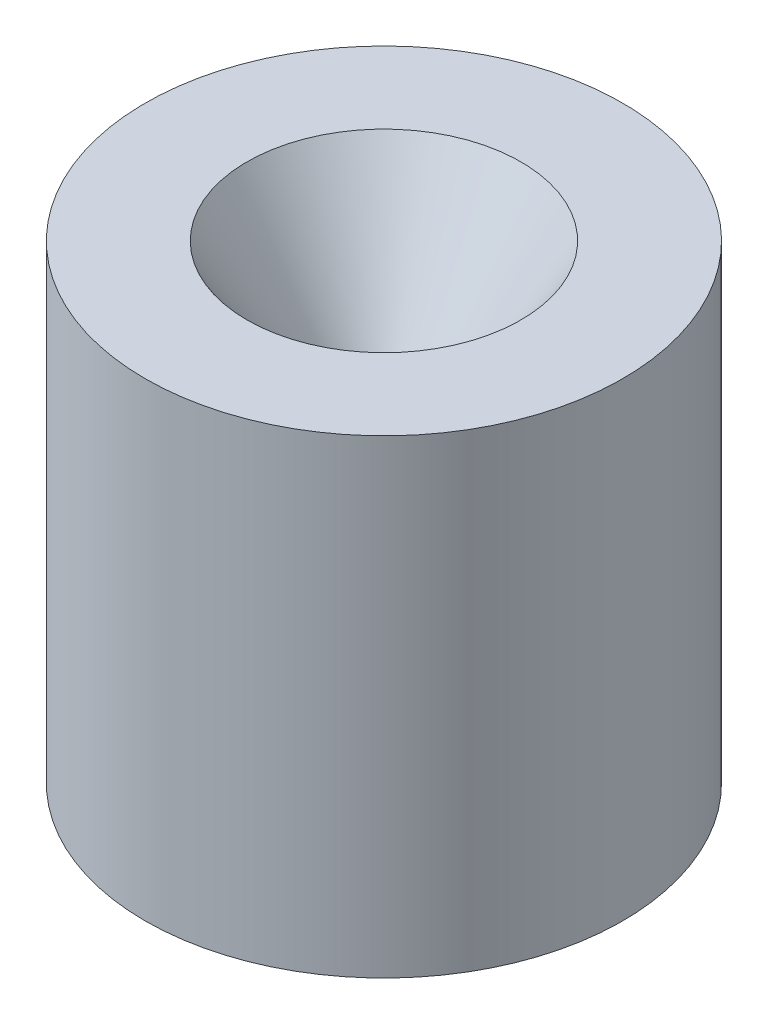
ISO-10303-21;
HEADER;
FILE_DESCRIPTION(('STEP AP214'),'2;1');
FILE_NAME('part.step','',(''),(''),'','','');
FILE_SCHEMA(('AUTOMOTIVE_DESIGN { 1 0 10303 214 1 1 1 1 }'));
ENDSEC;
DATA;
#1=APPLICATION_CONTEXT('core data for automotive mechanical design processes');
#2=APPLICATION_PROTOCOL_DEFINITION('international standard','automotive_design',2000,#1);
#3=PRODUCT_CONTEXT('',#1,'mechanical');
#4=PRODUCT('Part','Part','',(#3));
#5=PRODUCT_RELATED_PRODUCT_CATEGORY('part','',(#4));
#6=PRODUCT_DEFINITION_FORMATION('','',#4);
#7=PRODUCT_DEFINITION_CONTEXT('part definition',#1,'design');
#8=PRODUCT_DEFINITION('design','',#6,#7);
#9=PRODUCT_DEFINITION_SHAPE('','',#8);
#10=(LENGTH_UNIT() NAMED_UNIT(*) SI_UNIT(.MILLI.,.METRE.));
#11=(NAMED_UNIT(*) PLANE_ANGLE_UNIT() SI_UNIT($,.RADIAN.));
#12=(NAMED_UNIT(*) SI_UNIT($,.STERADIAN.) SOLID_ANGLE_UNIT());
#13=UNCERTAINTY_MEASURE_WITH_UNIT(LENGTH_MEASURE(1.E-05),#10,'distance_accuracy_value','');
#14=(GEOMETRIC_REPRESENTATION_CONTEXT(3) GLOBAL_UNCERTAINTY_ASSIGNED_CONTEXT((#13)) GLOBAL_UNIT_ASSIGNED_CONTEXT((#10,
#11,#12)) REPRESENTATION_CONTEXT('',''));
#15=CARTESIAN_POINT('',(0.,0.,0.));
#16=DIRECTION('',(0.,0.,1.));
#17=DIRECTION('',(1.,0.,0.));
#18=AXIS2_PLACEMENT_3D('',#15,#16,#17);
#19=CARTESIAN_POINT('',(0.,120.,0.));
#20=DIRECTION('',(0.,-1.,0.));
#21=DIRECTION('',(0.,0.,-1.));
#22=AXIS2_PLACEMENT_3D('',#19,#20,#21);
#23=CYLINDRICAL_SURFACE('',#22,61.);
#24=CARTESIAN_POINT('',(0.,120.,0.));
#25=DIRECTION('',(0.,1.,0.));
#26=DIRECTION('',(0.,0.,1.));
#27=AXIS2_PLACEMENT_3D('',#24,#25,#26);
#28=CIRCLE('',#27,61.);
#29=CARTESIAN_POINT('',(0.,120.,61.));
#30=VERTEX_POINT('',#29);
#31=EDGE_CURVE('E10',#30,#30,#28,.T.);
#32=ORIENTED_EDGE('',*,*,#31,.F.);
#33=EDGE_LOOP('',(#32));
#34=FACE_BOUND('',#33,.T.);
#35=CARTESIAN_POINT('',(0.,0.,0.));
#36=DIRECTION('',(0.,1.,0.));
#37=DIRECTION('',(0.,0.,1.));
#38=AXIS2_PLACEMENT_3D('',#35,#36,#37);
#39=CIRCLE('',#38,61.);
#40=CARTESIAN_POINT('',(0.,0.,61.));
#41=VERTEX_POINT('',#40);
#42=EDGE_CURVE('E35',#41,#41,#39,.T.);
#43=ORIENTED_EDGE('',*,*,#42,.T.);
#44=EDGE_LOOP('',(#43));
#45=FACE_BOUND('',#44,.T.);
#46=ADVANCED_FACE('F32',(#34,#45),#23,.T.);
#47=CARTESIAN_POINT('',(0.,120.,0.));
#48=DIRECTION('',(0.,1.,0.));
#49=DIRECTION('',(0.,0.,1.));
#50=AXIS2_PLACEMENT_3D('',#47,#48,#49);
#51=PLANE('',#50);
#52=CARTESIAN_POINT('',(0.,120.,0.));
#53=DIRECTION('',(0.,1.,0.));
#54=DIRECTION('',(0.,0.,1.));
#55=AXIS2_PLACEMENT_3D('',#52,#53,#54);
#56=CIRCLE('',#55,35.);
#57=CARTESIAN_POINT('',(0.,120.,35.));
#58=VERTEX_POINT('',#57);
#59=EDGE_CURVE('E46',#58,#58,#56,.T.);
#60=ORIENTED_EDGE('',*,*,#59,.F.);
#61=EDGE_LOOP('',(#60));
#62=FACE_BOUND('',#61,.T.);
#63=ORIENTED_EDGE('',*,*,#31,.T.);
#64=EDGE_LOOP('',(#63));
#65=FACE_BOUND('',#64,.T.);
#66=ADVANCED_FACE('F52',(#62,#65),#51,.T.);
#67=CARTESIAN_POINT('',(0.,0.,0.));
#68=DIRECTION('',(0.,1.,0.));
#69=DIRECTION('',(0.,0.,1.));
#70=AXIS2_PLACEMENT_3D('',#67,#68,#69);
#71=PLANE('',#70);
#72=ORIENTED_EDGE('',*,*,#42,.F.);
#73=EDGE_LOOP('',(#72));
#74=FACE_BOUND('',#73,.T.);
#75=ADVANCED_FACE('F54',(#74),#71,.F.);
#76=CARTESIAN_POINT('',(0.,120.,0.));
#77=DIRECTION('',(0.,1.,0.));
#78=DIRECTION('',(0.,0.,1.));
#79=AXIS2_PLACEMENT_3D('',#76,#77,#78);
#80=CONICAL_SURFACE('',#79,35.,0.558505360638186);
#81=CARTESIAN_POINT('',(0.,80.,0.));
#82=DIRECTION('',(0.,1.,0.));
#83=DIRECTION('',(0.,0.,1.));
#84=AXIS2_PLACEMENT_3D('',#81,#82,#83);
#85=CIRCLE('',#84,10.0052259236269);
#86=CARTESIAN_POINT('',(0.,80.,10.0052259236269));
#87=VERTEX_POINT('',#86);
#88=EDGE_CURVE('E42',#87,#87,#85,.T.);
#89=CARTESIAN_POINT('',(0.,80.,10.0052259236269));
#90=CARTESIAN_POINT('',(0.,80.4166666666666,10.2655881535891));
#91=CARTESIAN_POINT('',(0.,80.8333333333333,10.5259503835513));
#92=CARTESIAN_POINT('',(0.,81.6666666666666,11.0466748434758));
#93=CARTESIAN_POINT('',(0.,82.0833333333333,11.307037073438));
#94=CARTESIAN_POINT('',(0.,82.9166666666666,11.8277615333624));
#95=CARTESIAN_POINT('',(0.,83.3333333333333,12.0881237633246));
#96=CARTESIAN_POINT('',(0.,84.1666666666666,12.6088482232491));
#97=CARTESIAN_POINT('',(0.,84.5833333333333,12.8692104532113));
#98=CARTESIAN_POINT('',(0.,85.4166666666666,13.3899349131357));
#99=CARTESIAN_POINT('',(0.,85.8333333333333,13.650297143098));
#100=CARTESIAN_POINT('',(0.,86.6666666666666,14.1710216030224));
#101=CARTESIAN_POINT('',(0.,87.0833333333333,14.4313838329846));
#102=CARTESIAN_POINT('',(0.,87.9166666666666,14.9521082929091));
#103=CARTESIAN_POINT('',(0.,88.3333333333333,15.2124705228713));
#104=CARTESIAN_POINT('',(0.,89.1666666666666,15.7331949827957));
#105=CARTESIAN_POINT('',(0.,89.5833333333333,15.9935572127579));
#106=CARTESIAN_POINT('',(0.,90.4166666666666,16.5142816726824));
#107=CARTESIAN_POINT('',(0.,90.8333333333333,16.7746439026446));
#108=CARTESIAN_POINT('',(0.,91.6666666666666,17.295368362569));
#109=CARTESIAN_POINT('',(0.,92.0833333333333,17.5557305925313));
#110=CARTESIAN_POINT('',(0.,92.9166666666666,18.0764550524557));
#111=CARTESIAN_POINT('',(0.,93.3333333333333,18.3368172824179));
#112=CARTESIAN_POINT('',(0.,94.1666666666666,18.8575417423424));
#113=CARTESIAN_POINT('',(0.,94.5833333333333,19.1179039723046));
#114=CARTESIAN_POINT('',(0.,95.4166666666666,19.638628432229));
#115=CARTESIAN_POINT('',(0.,95.8333333333333,19.8989906621912));
#116=CARTESIAN_POINT('',(0.,96.6666666666666,20.4197151221157));
#117=CARTESIAN_POINT('',(0.,97.0833333333333,20.6800773520779));
#118=CARTESIAN_POINT('',(0.,97.9166666666666,21.2008018120023));
#119=CARTESIAN_POINT('',(0.,98.3333333333333,21.4611640419646));
#120=CARTESIAN_POINT('',(0.,99.1666666666666,21.981888501889));
#121=CARTESIAN_POINT('',(0.,99.5833333333333,22.2422507318512));
#122=CARTESIAN_POINT('',(0.,100.416666666667,22.7629751917757));
#123=CARTESIAN_POINT('',(0.,100.833333333333,23.0233374217379));
#124=CARTESIAN_POINT('',(0.,101.666666666667,23.5440618816623));
#125=CARTESIAN_POINT('',(0.,102.083333333333,23.8044241116245));
#126=CARTESIAN_POINT('',(0.,102.916666666667,24.325148571549));
#127=CARTESIAN_POINT('',(0.,103.333333333333,24.5855108015112));
#128=CARTESIAN_POINT('',(0.,104.166666666667,25.1062352614356));
#129=CARTESIAN_POINT('',(0.,104.583333333333,25.3665974913979));
#130=CARTESIAN_POINT('',(0.,105.416666666667,25.8873219513223));
#131=CARTESIAN_POINT('',(0.,105.833333333333,26.1476841812845));
#132=CARTESIAN_POINT('',(0.,106.666666666667,26.668408641209));
#133=CARTESIAN_POINT('',(0.,107.083333333333,26.9287708711712));
#134=CARTESIAN_POINT('',(0.,107.916666666667,27.4494953310956));
#135=CARTESIAN_POINT('',(0.,108.333333333333,27.7098575610578));
#136=CARTESIAN_POINT('',(0.,109.166666666667,28.2305820209823));
#137=CARTESIAN_POINT('',(0.,109.583333333333,28.4909442509445));
#138=CARTESIAN_POINT('',(0.,110.416666666667,29.0116687108689));
#139=CARTESIAN_POINT('',(0.,110.833333333333,29.2720309408312));
#140=CARTESIAN_POINT('',(0.,111.666666666667,29.7927554007556));
#141=CARTESIAN_POINT('',(0.,112.083333333333,30.0531176307178));
#142=CARTESIAN_POINT('',(0.,112.916666666667,30.5738420906423));
#143=CARTESIAN_POINT('',(0.,113.333333333333,30.8342043206045));
#144=CARTESIAN_POINT('',(0.,114.166666666667,31.3549287805289));
#145=CARTESIAN_POINT('',(0.,114.583333333333,31.6152910104911));
#146=CARTESIAN_POINT('',(0.,115.416666666667,32.1360154704156));
#147=CARTESIAN_POINT('',(0.,115.833333333333,32.3963777003778));
#148=CARTESIAN_POINT('',(0.,116.666666666667,32.9171021603022));
#149=CARTESIAN_POINT('',(0.,117.083333333333,33.1774643902645));
#150=CARTESIAN_POINT('',(0.,117.916666666667,33.6981888501889));
#151=CARTESIAN_POINT('',(0.,118.333333333333,33.9585510801511));
#152=CARTESIAN_POINT('',(0.,119.166666666667,34.4792755400756));
#153=CARTESIAN_POINT('',(0.,119.583333333333,34.7396377700378));
#154=CARTESIAN_POINT('',(0.,120.,35.));
#155=B_SPLINE_CURVE_WITH_KNOTS('',3,(#89,#90,#91,#92,#93,#94,#95,#96,#97,#98,#99,#100,#101,#102,
#103,#104,#105,#106,#107,#108,#109,#110,#111,#112,#113,#114,#115,#116,#117,#118,#119,#120,#121,
#122,#123,#124,#125,#126,#127,#128,#129,#130,#131,#132,#133,#134,#135,#136,#137,#138,#139,#140,
#141,#142,#143,#144,#145,#146,#147,#148,#149,#150,#151,#152,#153,#154),.UNSPECIFIED.,.F.,.F.,(4,
2,2,2,2,2,2,2,2,2,2,2,2,2,2,2,2,2,2,2,2,2,2,2,2,2,2,2,2,2,2,2,4),(0.,1.47397300420262,
2.94794600840524,4.42191901260787,5.89589201681049,7.36986502101311,8.84383802521573,
10.3178110294183,11.791784033621,13.2657570378236,14.7397300420262,16.2137030462288,
17.6876760504315,19.1616490546341,20.6356220588367,22.1095950630393,23.5835680672419,
25.0575410714446,26.5315140756472,28.0054870798498,29.4794600840524,30.9534330882551,
32.4274060924577,33.9013790966603,35.3753521008629,36.8493251050655,38.3232981092682,
39.7972711134708,41.2712441176734,42.745217121876,44.2191901260787,45.6931631302813,
47.1671361344839),.UNSPECIFIED.);
#156=EDGE_CURVE('BSEAM50',#87,#58,#155,.T.);
#157=ORIENTED_EDGE('',*,*,#88,.F.);
#158=ORIENTED_EDGE('',*,*,#59,.T.);
#159=ORIENTED_EDGE('',*,*,#156,.T.);
#160=ORIENTED_EDGE('',*,*,#156,.F.);
#161=EDGE_LOOP('',(#157,#159,#158,#160));
#162=FACE_BOUND('',#161,.T.);
#163=ADVANCED_FACE('F50',(#162),#80,.F.);
#164=CARTESIAN_POINT('',(0.,80.,0.));
#165=DIRECTION('',(0.,1.,0.));
#166=DIRECTION('',(0.,0.,1.));
#167=AXIS2_PLACEMENT_3D('',#164,#165,#166);
#168=PLANE('',#167);
#169=ORIENTED_EDGE('',*,*,#88,.T.);
#170=EDGE_LOOP('',(#169));
#171=FACE_BOUND('',#170,.T.);
#172=ADVANCED_FACE('F65',(#171),#168,.T.);
#173=CLOSED_SHELL('',(#46,#66,#75,#163,#172));
#174=MANIFOLD_SOLID_BREP('B2',#173);
#175=ADVANCED_BREP_SHAPE_REPRESENTATION('',(#18,#174),#14);
#176=SHAPE_DEFINITION_REPRESENTATION(#9,#175);
ENDSEC;
END-ISO-10303-21;
